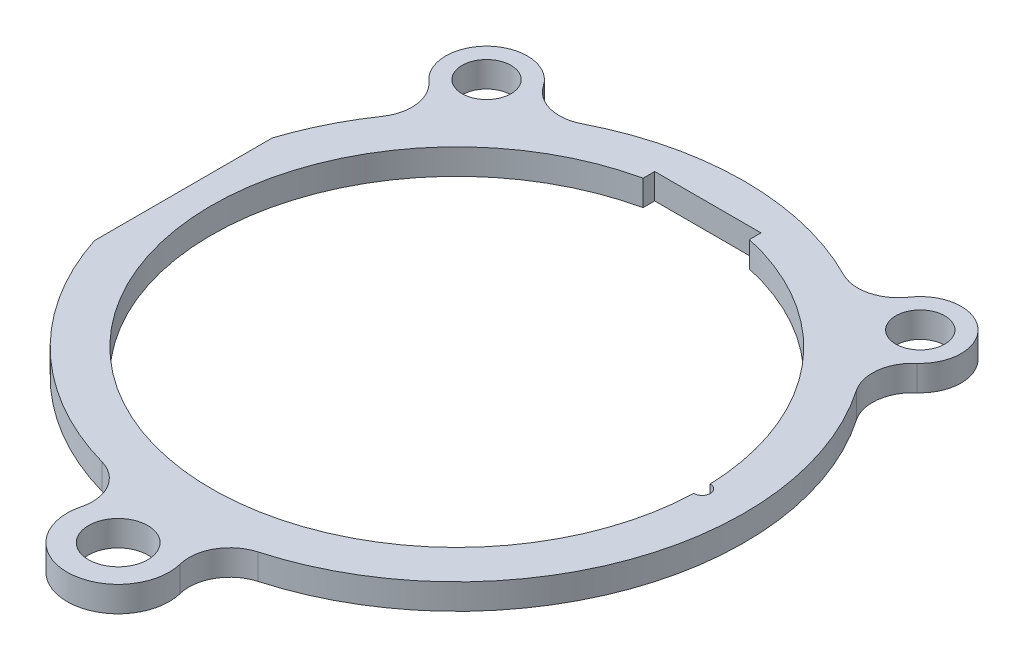
ISO-10303-21;
HEADER;
FILE_DESCRIPTION(('STEP AP214'),'2;1');
FILE_NAME('part.step','',(''),(''),'','','');
FILE_SCHEMA(('AUTOMOTIVE_DESIGN { 1 0 10303 214 1 1 1 1 }'));
ENDSEC;
DATA;
#1=APPLICATION_CONTEXT('core data for automotive mechanical design processes');
#2=APPLICATION_PROTOCOL_DEFINITION('international standard','automotive_design',2000,#1);
#3=PRODUCT_CONTEXT('',#1,'mechanical');
#4=PRODUCT('Part','Part','',(#3));
#5=PRODUCT_RELATED_PRODUCT_CATEGORY('part','',(#4));
#6=PRODUCT_DEFINITION_FORMATION('','',#4);
#7=PRODUCT_DEFINITION_CONTEXT('part definition',#1,'design');
#8=PRODUCT_DEFINITION('design','',#6,#7);
#9=PRODUCT_DEFINITION_SHAPE('','',#8);
#10=(LENGTH_UNIT() NAMED_UNIT(*) SI_UNIT(.MILLI.,.METRE.));
#11=(NAMED_UNIT(*) PLANE_ANGLE_UNIT() SI_UNIT($,.RADIAN.));
#12=(NAMED_UNIT(*) SI_UNIT($,.STERADIAN.) SOLID_ANGLE_UNIT());
#13=UNCERTAINTY_MEASURE_WITH_UNIT(LENGTH_MEASURE(1.E-05),#10,'distance_accuracy_value','');
#14=(GEOMETRIC_REPRESENTATION_CONTEXT(3) GLOBAL_UNCERTAINTY_ASSIGNED_CONTEXT((#13)) GLOBAL_UNIT_ASSIGNED_CONTEXT((#10,
#11,#12)) REPRESENTATION_CONTEXT('',''));
#15=CARTESIAN_POINT('',(0.,0.,0.));
#16=DIRECTION('',(0.,0.,1.));
#17=DIRECTION('',(1.,0.,0.));
#18=AXIS2_PLACEMENT_3D('',#15,#16,#17);
#19=CARTESIAN_POINT('',(0.,-0.79375,0.));
#20=DIRECTION('',(0.,1.,0.));
#21=DIRECTION('',(0.,0.,1.));
#22=AXIS2_PLACEMENT_3D('',#19,#20,#21);
#23=CYLINDRICAL_SURFACE('',#22,17.8599650524873);
#24=CARTESIAN_POINT('',(0.,-0.79375,0.));
#25=DIRECTION('',(0.,1.,0.));
#26=DIRECTION('',(0.,0.,1.));
#27=AXIS2_PLACEMENT_3D('',#24,#25,#26);
#28=CIRCLE('',#27,17.8599650524873);
#29=CARTESIAN_POINT('',(-16.9840587441892,-0.79375,5.5245));
#30=VERTEX_POINT('',#29);
#31=CARTESIAN_POINT('',(-4.85058295667171,-0.79375,17.1886647723584));
#32=VERTEX_POINT('',#31);
#33=EDGE_CURVE('E280',#30,#32,#28,.T.);
#34=ORIENTED_EDGE('',*,*,#33,.T.);
#35=DIRECTION('',(0.,1.,0.));
#36=VECTOR('',#35,1.);
#37=CARTESIAN_POINT('',(-4.85058295667171,-0.79375,17.1886647723584));
#38=LINE('',#37,#36);
#39=CARTESIAN_POINT('',(-4.85058295667171,0.79375,17.1886647723584));
#40=VERTEX_POINT('',#39);
#41=EDGE_CURVE('E218',#32,#40,#38,.T.);
#42=ORIENTED_EDGE('',*,*,#41,.T.);
#43=CARTESIAN_POINT('',(0.,0.79375,0.));
#44=DIRECTION('',(0.,1.,0.));
#45=DIRECTION('',(0.,0.,1.));
#46=AXIS2_PLACEMENT_3D('',#43,#44,#45);
#47=CIRCLE('',#46,17.8599650524873);
#48=CARTESIAN_POINT('',(-16.9840587441892,0.79375,5.5245));
#49=VERTEX_POINT('',#48);
#50=EDGE_CURVE('E273',#49,#40,#47,.T.);
#51=ORIENTED_EDGE('',*,*,#50,.F.);
#52=DIRECTION('',(0.,1.,0.));
#53=VECTOR('',#52,1.);
#54=CARTESIAN_POINT('',(-16.9840587441892,-0.79375,5.5245));
#55=LINE('',#54,#53);
#56=EDGE_CURVE('E304',#30,#49,#55,.T.);
#57=ORIENTED_EDGE('',*,*,#56,.F.);
#58=EDGE_LOOP('',(#34,#42,#51,#57));
#59=FACE_BOUND('',#58,.T.);
#60=ADVANCED_FACE('F37',(#59),#23,.T.);
#61=CARTESIAN_POINT('',(0.,-0.79375,0.));
#62=DIRECTION('',(0.,1.,0.));
#63=DIRECTION('',(0.,0.,1.));
#64=AXIS2_PLACEMENT_3D('',#61,#62,#63);
#65=CYLINDRICAL_SURFACE('',#64,17.8599650524873);
#66=DIRECTION('',(0.,1.,0.));
#67=VECTOR('',#66,1.);
#68=CARTESIAN_POINT('',(4.85058295667171,-0.79375,17.1886647723584));
#69=LINE('',#68,#67);
#70=CARTESIAN_POINT('',(4.85058295667171,-0.79375,17.1886647723584));
#71=VERTEX_POINT('',#70);
#72=CARTESIAN_POINT('',(4.85058295667171,0.79375,17.1886647723584));
#73=VERTEX_POINT('',#72);
#74=EDGE_CURVE('E197',#71,#73,#69,.T.);
#75=ORIENTED_EDGE('',*,*,#74,.F.);
#76=CARTESIAN_POINT('',(0.,-0.79375,0.));
#77=DIRECTION('',(0.,1.,0.));
#78=DIRECTION('',(0.,0.,1.));
#79=AXIS2_PLACEMENT_3D('',#76,#77,#78);
#80=CIRCLE('',#79,17.8599650524873);
#81=CARTESIAN_POINT('',(14.741706385558,-0.79375,-10.0826804232836));
#82=VERTEX_POINT('',#81);
#83=EDGE_CURVE('E184',#71,#82,#80,.T.);
#84=ORIENTED_EDGE('',*,*,#83,.T.);
#85=DIRECTION('',(0.,1.,0.));
#86=VECTOR('',#85,1.);
#87=CARTESIAN_POINT('',(14.741706385558,-0.79375,-10.0826804232836));
#88=LINE('',#87,#86);
#89=CARTESIAN_POINT('',(14.741706385558,0.79375,-10.0826804232836));
#90=VERTEX_POINT('',#89);
#91=EDGE_CURVE('E270',#82,#90,#88,.T.);
#92=ORIENTED_EDGE('',*,*,#91,.T.);
#93=CARTESIAN_POINT('',(0.,0.79375,0.));
#94=DIRECTION('',(0.,1.,0.));
#95=DIRECTION('',(0.,0.,1.));
#96=AXIS2_PLACEMENT_3D('',#93,#94,#95);
#97=CIRCLE('',#96,17.8599650524873);
#98=EDGE_CURVE('E284',#73,#90,#97,.T.);
#99=ORIENTED_EDGE('',*,*,#98,.F.);
#100=EDGE_LOOP('',(#75,#84,#92,#99));
#101=FACE_BOUND('',#100,.T.);
#102=ADVANCED_FACE('F380',(#101),#65,.T.);
#103=CARTESIAN_POINT('',(0.,0.79375,0.));
#104=DIRECTION('',(0.,1.,0.));
#105=DIRECTION('',(0.,0.,1.));
#106=AXIS2_PLACEMENT_3D('',#103,#104,#105);
#107=PLANE('',#106);
#108=CARTESIAN_POINT('',(5.54042085242001,0.79375,19.6331941089771));
#109=DIRECTION('',(0.,1.,0.));
#110=DIRECTION('',(0.,0.,1.));
#111=AXIS2_PLACEMENT_3D('',#108,#109,#110);
#112=CIRCLE('',#111,2.54);
#113=CARTESIAN_POINT('',(3.07801158467778,0.79375,20.2562034172039));
#114=VERTEX_POINT('',#113);
#115=EDGE_CURVE('E193',#73,#114,#112,.T.);
#116=ORIENTED_EDGE('',*,*,#115,.F.);
#117=ORIENTED_EDGE('',*,*,#98,.T.);
#118=CARTESIAN_POINT('',(16.8382353602383,0.79375,-11.5166142635726));
#119=DIRECTION('',(0.,1.,0.));
#120=DIRECTION('',(0.,0.,1.));
#121=AXIS2_PLACEMENT_3D('',#118,#119,#120);
#122=CIRCLE('',#121,2.54);
#123=CARTESIAN_POINT('',(15.1544210313661,0.79375,-13.41828965803));
#124=VERTEX_POINT('',#123);
#125=EDGE_CURVE('E242',#124,#90,#122,.T.);
#126=ORIENTED_EDGE('',*,*,#125,.F.);
#127=CARTESIAN_POINT('',(13.4706067024938,0.79375,-15.3199650524873));
#128=DIRECTION('',(0.,1.,0.));
#129=DIRECTION('',(0.,0.,1.));
#130=AXIS2_PLACEMENT_3D('',#127,#128,#129);
#131=CIRCLE('',#130,2.54);
#132=CARTESIAN_POINT('',(11.3691296286891,0.79375,-16.746637442447));
#133=VERTEX_POINT('',#132);
#134=EDGE_CURVE('E262',#124,#133,#131,.T.);
#135=ORIENTED_EDGE('',*,*,#134,.T.);
#136=CARTESIAN_POINT('',(9.26765255488442,0.79375,-18.1733098324067));
#137=DIRECTION('',(0.,1.,0.));
#138=DIRECTION('',(0.,0.,1.));
#139=AXIS2_PLACEMENT_3D('',#136,#137,#138);
#140=CIRCLE('',#139,2.54);
#141=CARTESIAN_POINT('',(8.11373697567434,0.79375,-15.9105507122049));
#142=VERTEX_POINT('',#141);
#143=EDGE_CURVE('E265',#142,#133,#140,.T.);
#144=ORIENTED_EDGE('',*,*,#143,.F.);
#145=CARTESIAN_POINT('',(0.,0.79375,0.));
#146=DIRECTION('',(0.,1.,0.));
#147=DIRECTION('',(0.,0.,1.));
#148=AXIS2_PLACEMENT_3D('',#145,#146,#147);
#149=CIRCLE('',#148,17.8599650524873);
#150=CARTESIAN_POINT('',(-8.11373697567434,0.79375,-15.9105507122049));
#151=VERTEX_POINT('',#150);
#152=EDGE_CURVE('E60',#142,#151,#149,.T.);
#153=ORIENTED_EDGE('',*,*,#152,.T.);
#154=CARTESIAN_POINT('',(-9.26765255488442,0.79375,-18.1733098324067));
#155=DIRECTION('',(0.,1.,0.));
#156=DIRECTION('',(0.,0.,1.));
#157=AXIS2_PLACEMENT_3D('',#154,#155,#156);
#158=CIRCLE('',#157,2.54);
#159=CARTESIAN_POINT('',(-11.3691296286891,0.79375,-16.746637442447));
#160=VERTEX_POINT('',#159);
#161=EDGE_CURVE('E217',#160,#151,#158,.T.);
#162=ORIENTED_EDGE('',*,*,#161,.F.);
#163=CARTESIAN_POINT('',(-13.4706067024938,0.79375,-15.3199650524873));
#164=DIRECTION('',(0.,1.,0.));
#165=DIRECTION('',(0.,0.,1.));
#166=AXIS2_PLACEMENT_3D('',#163,#164,#165);
#167=CIRCLE('',#166,2.54);
#168=CARTESIAN_POINT('',(-15.1544210313661,0.79375,-13.41828965803));
#169=VERTEX_POINT('',#168);
#170=EDGE_CURVE('E235',#160,#169,#167,.T.);
#171=ORIENTED_EDGE('',*,*,#170,.T.);
#172=CARTESIAN_POINT('',(-16.8382353602383,0.79375,-11.5166142635726));
#173=DIRECTION('',(0.,1.,0.));
#174=DIRECTION('',(0.,0.,1.));
#175=AXIS2_PLACEMENT_3D('',#172,#173,#174);
#176=CIRCLE('',#175,2.54);
#177=CARTESIAN_POINT('',(-14.741706385558,0.79375,-10.0826804232836));
#178=VERTEX_POINT('',#177);
#179=EDGE_CURVE('E52',#178,#169,#176,.T.);
#180=ORIENTED_EDGE('',*,*,#179,.F.);
#181=CARTESIAN_POINT('',(-16.9840587441892,0.79375,-5.5245));
#182=VERTEX_POINT('',#181);
#183=EDGE_CURVE('E292',#178,#182,#149,.T.);
#184=ORIENTED_EDGE('',*,*,#183,.T.);
#185=DIRECTION('',(0.,0.,-1.));
#186=VECTOR('',#185,1.);
#187=CARTESIAN_POINT('',(-16.9840587441892,0.79375,-5.5245));
#188=LINE('',#187,#186);
#189=EDGE_CURVE('E300',#49,#182,#188,.T.);
#190=ORIENTED_EDGE('',*,*,#189,.F.);
#191=ORIENTED_EDGE('',*,*,#50,.T.);
#192=CARTESIAN_POINT('',(-5.54042085242001,0.79375,19.6331941089771));
#193=DIRECTION('',(0.,1.,0.));
#194=DIRECTION('',(0.,0.,1.));
#195=AXIS2_PLACEMENT_3D('',#192,#193,#194);
#196=CIRCLE('',#195,2.54);
#197=CARTESIAN_POINT('',(-3.07801158467778,0.79375,20.2562034172039));
#198=VERTEX_POINT('',#197);
#199=EDGE_CURVE('E205',#198,#40,#196,.T.);
#200=ORIENTED_EDGE('',*,*,#199,.F.);
#201=CARTESIAN_POINT('',(0.,0.79375,21.0349650524873));
#202=DIRECTION('',(0.,1.,0.));
#203=DIRECTION('',(0.,0.,1.));
#204=AXIS2_PLACEMENT_3D('',#201,#202,#203);
#205=CIRCLE('',#204,3.175);
#206=EDGE_CURVE('E212',#198,#114,#205,.T.);
#207=ORIENTED_EDGE('',*,*,#206,.T.);
#208=EDGE_LOOP('',(#116,#117,#126,#135,#144,#153,#162,#171,#180,#184,#190,#191,#200,#207));
#209=FACE_BOUND('',#208,.T.);
#210=CARTESIAN_POINT('',(15.24,0.79375,0.));
#211=DIRECTION('',(0.,1.,0.));
#212=DIRECTION('',(0.,0.,1.));
#213=AXIS2_PLACEMENT_3D('',#210,#211,#212);
#214=CIRCLE('',#213,0.508000000000006);
#215=CARTESIAN_POINT('',(15.2315333333333,0.79375,0.507929439544078));
#216=VERTEX_POINT('',#215);
#217=CARTESIAN_POINT('',(15.2315333333333,0.79375,-0.507929439544078));
#218=VERTEX_POINT('',#217);
#219=EDGE_CURVE('E289',#216,#218,#214,.T.);
#220=ORIENTED_EDGE('',*,*,#219,.F.);
#221=CARTESIAN_POINT('',(0.,0.79375,0.));
#222=DIRECTION('',(0.,1.,0.));
#223=DIRECTION('',(0.,0.,1.));
#224=AXIS2_PLACEMENT_3D('',#221,#222,#223);
#225=CIRCLE('',#224,15.24);
#226=CARTESIAN_POINT('',(-3.302,0.79375,-14.8779835999372));
#227=VERTEX_POINT('',#226);
#228=EDGE_CURVE('E313',#227,#216,#225,.T.);
#229=ORIENTED_EDGE('',*,*,#228,.F.);
#230=DIRECTION('',(0.,0.,1.));
#231=VECTOR('',#230,1.);
#232=CARTESIAN_POINT('',(-3.30199999999999,0.79375,0.));
#233=LINE('',#232,#231);
#234=CARTESIAN_POINT('',(-3.302,0.79375,-15.5956));
#235=VERTEX_POINT('',#234);
#236=EDGE_CURVE('E316',#235,#227,#233,.T.);
#237=ORIENTED_EDGE('',*,*,#236,.F.);
#238=DIRECTION('',(1.,0.,0.));
#239=VECTOR('',#238,1.);
#240=CARTESIAN_POINT('',(0.,0.79375,-15.5956));
#241=LINE('',#240,#239);
#242=CARTESIAN_POINT('',(3.302,0.79375,-15.5956));
#243=VERTEX_POINT('',#242);
#244=EDGE_CURVE('E320',#235,#243,#241,.T.);
#245=ORIENTED_EDGE('',*,*,#244,.T.);
#246=DIRECTION('',(0.,0.,1.));
#247=VECTOR('',#246,1.);
#248=CARTESIAN_POINT('',(3.302,0.79375,0.));
#249=LINE('',#248,#247);
#250=CARTESIAN_POINT('',(3.302,0.79375,-14.8779835999372));
#251=VERTEX_POINT('',#250);
#252=EDGE_CURVE('E322',#243,#251,#249,.T.);
#253=ORIENTED_EDGE('',*,*,#252,.T.);
#254=EDGE_CURVE('E317',#218,#251,#225,.T.);
#255=ORIENTED_EDGE('',*,*,#254,.F.);
#256=EDGE_LOOP('',(#220,#229,#237,#245,#253,#255));
#257=FACE_BOUND('',#256,.T.);
#258=CARTESIAN_POINT('',(13.4706067024938,0.79375,-15.3199650524873));
#259=DIRECTION('',(0.,1.,0.));
#260=DIRECTION('',(0.,0.,1.));
#261=AXIS2_PLACEMENT_3D('',#258,#259,#260);
#262=CIRCLE('',#261,1.524);
#263=CARTESIAN_POINT('',(13.4706067024938,0.79375,-13.7959650524873));
#264=VERTEX_POINT('',#263);
#265=EDGE_CURVE('E251',#264,#264,#262,.T.);
#266=ORIENTED_EDGE('',*,*,#265,.F.);
#267=EDGE_LOOP('',(#266));
#268=FACE_BOUND('',#267,.T.);
#269=CARTESIAN_POINT('',(-13.4706067024938,0.79375,-15.3199650524873));
#270=DIRECTION('',(0.,1.,0.));
#271=DIRECTION('',(0.,0.,1.));
#272=AXIS2_PLACEMENT_3D('',#269,#270,#271);
#273=CIRCLE('',#272,1.524);
#274=CARTESIAN_POINT('',(-13.4706067024938,0.79375,-13.7959650524873));
#275=VERTEX_POINT('',#274);
#276=EDGE_CURVE('E225',#275,#275,#273,.T.);
#277=ORIENTED_EDGE('',*,*,#276,.F.);
#278=EDGE_LOOP('',(#277));
#279=FACE_BOUND('',#278,.T.);
#280=CARTESIAN_POINT('',(0.,0.79375,21.0349650524873));
#281=DIRECTION('',(0.,1.,0.));
#282=DIRECTION('',(0.,0.,1.));
#283=AXIS2_PLACEMENT_3D('',#280,#281,#282);
#284=CIRCLE('',#283,1.8415);
#285=CARTESIAN_POINT('',(0.,0.79375,22.8764650524873));
#286=VERTEX_POINT('',#285);
#287=EDGE_CURVE('E209',#286,#286,#284,.T.);
#288=ORIENTED_EDGE('',*,*,#287,.F.);
#289=EDGE_LOOP('',(#288));
#290=FACE_BOUND('',#289,.T.);
#291=ADVANCED_FACE('F366',(#209,#257,#268,#279,#290),#107,.T.);
#292=CARTESIAN_POINT('',(0.,-0.79375,0.));
#293=DIRECTION('',(0.,1.,0.));
#294=DIRECTION('',(0.,0.,1.));
#295=AXIS2_PLACEMENT_3D('',#292,#293,#294);
#296=PLANE('',#295);
#297=ORIENTED_EDGE('',*,*,#83,.F.);
#298=CARTESIAN_POINT('',(5.54042085242001,-0.79375,19.6331941089771));
#299=DIRECTION('',(0.,1.,0.));
#300=DIRECTION('',(0.,0.,1.));
#301=AXIS2_PLACEMENT_3D('',#298,#299,#300);
#302=CIRCLE('',#301,2.54);
#303=CARTESIAN_POINT('',(3.07801158467778,-0.79375,20.2562034172039));
#304=VERTEX_POINT('',#303);
#305=EDGE_CURVE('E177',#71,#304,#302,.T.);
#306=ORIENTED_EDGE('',*,*,#305,.T.);
#307=CARTESIAN_POINT('',(0.,-0.79375,21.0349650524873));
#308=DIRECTION('',(0.,1.,0.));
#309=DIRECTION('',(0.,0.,1.));
#310=AXIS2_PLACEMENT_3D('',#307,#308,#309);
#311=CIRCLE('',#310,3.175);
#312=CARTESIAN_POINT('',(-3.07801158467778,-0.79375,20.2562034172039));
#313=VERTEX_POINT('',#312);
#314=EDGE_CURVE('E182',#313,#304,#311,.T.);
#315=ORIENTED_EDGE('',*,*,#314,.F.);
#316=CARTESIAN_POINT('',(-5.54042085242001,-0.79375,19.6331941089771));
#317=DIRECTION('',(0.,1.,0.));
#318=DIRECTION('',(0.,0.,1.));
#319=AXIS2_PLACEMENT_3D('',#316,#317,#318);
#320=CIRCLE('',#319,2.54);
#321=EDGE_CURVE('E188',#313,#32,#320,.T.);
#322=ORIENTED_EDGE('',*,*,#321,.T.);
#323=ORIENTED_EDGE('',*,*,#33,.F.);
#324=DIRECTION('',(0.,0.,-1.));
#325=VECTOR('',#324,1.);
#326=CARTESIAN_POINT('',(-16.9840587441892,-0.79375,-5.5245));
#327=LINE('',#326,#325);
#328=CARTESIAN_POINT('',(-16.9840587441892,-0.79375,-5.5245));
#329=VERTEX_POINT('',#328);
#330=EDGE_CURVE('E301',#30,#329,#327,.T.);
#331=ORIENTED_EDGE('',*,*,#330,.T.);
#332=CARTESIAN_POINT('',(0.,-0.79375,0.));
#333=DIRECTION('',(0.,1.,0.));
#334=DIRECTION('',(0.,0.,1.));
#335=AXIS2_PLACEMENT_3D('',#332,#333,#334);
#336=CIRCLE('',#335,17.8599650524873);
#337=CARTESIAN_POINT('',(-14.741706385558,-0.79375,-10.0826804232836));
#338=VERTEX_POINT('',#337);
#339=EDGE_CURVE('E283',#338,#329,#336,.T.);
#340=ORIENTED_EDGE('',*,*,#339,.F.);
#341=CARTESIAN_POINT('',(-16.8382353602383,-0.79375,-11.5166142635726));
#342=DIRECTION('',(0.,1.,0.));
#343=DIRECTION('',(0.,0.,1.));
#344=AXIS2_PLACEMENT_3D('',#341,#342,#343);
#345=CIRCLE('',#344,2.54);
#346=CARTESIAN_POINT('',(-15.1544210313661,-0.79375,-13.41828965803));
#347=VERTEX_POINT('',#346);
#348=EDGE_CURVE('E228',#338,#347,#345,.T.);
#349=ORIENTED_EDGE('',*,*,#348,.T.);
#350=CARTESIAN_POINT('',(-13.4706067024938,-0.79375,-15.3199650524873));
#351=DIRECTION('',(0.,1.,0.));
#352=DIRECTION('',(0.,0.,1.));
#353=AXIS2_PLACEMENT_3D('',#350,#351,#352);
#354=CIRCLE('',#353,2.54);
#355=CARTESIAN_POINT('',(-11.3691296286891,-0.79375,-16.746637442447));
#356=VERTEX_POINT('',#355);
#357=EDGE_CURVE('E224',#356,#347,#354,.T.);
#358=ORIENTED_EDGE('',*,*,#357,.F.);
#359=CARTESIAN_POINT('',(-9.26765255488442,-0.79375,-18.1733098324067));
#360=DIRECTION('',(0.,1.,0.));
#361=DIRECTION('',(0.,0.,1.));
#362=AXIS2_PLACEMENT_3D('',#359,#360,#361);
#363=CIRCLE('',#362,2.54);
#364=CARTESIAN_POINT('',(-8.11373697567434,-0.79375,-15.9105507122049));
#365=VERTEX_POINT('',#364);
#366=EDGE_CURVE('E222',#356,#365,#363,.T.);
#367=ORIENTED_EDGE('',*,*,#366,.T.);
#368=CARTESIAN_POINT('',(8.11373697567434,-0.79375,-15.9105507122049));
#369=VERTEX_POINT('',#368);
#370=EDGE_CURVE('E285',#369,#365,#336,.T.);
#371=ORIENTED_EDGE('',*,*,#370,.F.);
#372=CARTESIAN_POINT('',(9.26765255488442,-0.79375,-18.1733098324067));
#373=DIRECTION('',(0.,1.,0.));
#374=DIRECTION('',(0.,0.,1.));
#375=AXIS2_PLACEMENT_3D('',#372,#373,#374);
#376=CIRCLE('',#375,2.54);
#377=CARTESIAN_POINT('',(11.3691296286891,-0.79375,-16.746637442447));
#378=VERTEX_POINT('',#377);
#379=EDGE_CURVE('E254',#369,#378,#376,.T.);
#380=ORIENTED_EDGE('',*,*,#379,.T.);
#381=CARTESIAN_POINT('',(13.4706067024938,-0.79375,-15.3199650524873));
#382=DIRECTION('',(0.,1.,0.));
#383=DIRECTION('',(0.,0.,1.));
#384=AXIS2_PLACEMENT_3D('',#381,#382,#383);
#385=CIRCLE('',#384,2.54);
#386=CARTESIAN_POINT('',(15.1544210313661,-0.79375,-13.41828965803));
#387=VERTEX_POINT('',#386);
#388=EDGE_CURVE('E250',#387,#378,#385,.T.);
#389=ORIENTED_EDGE('',*,*,#388,.F.);
#390=CARTESIAN_POINT('',(16.8382353602383,-0.79375,-11.5166142635726));
#391=DIRECTION('',(0.,1.,0.));
#392=DIRECTION('',(0.,0.,1.));
#393=AXIS2_PLACEMENT_3D('',#390,#391,#392);
#394=CIRCLE('',#393,2.54);
#395=EDGE_CURVE('E248',#387,#82,#394,.T.);
#396=ORIENTED_EDGE('',*,*,#395,.T.);
#397=EDGE_LOOP('',(#297,#306,#315,#322,#323,#331,#340,#349,#358,#367,#371,#380,#389,#396));
#398=FACE_BOUND('',#397,.T.);
#399=CARTESIAN_POINT('',(0.,-0.79375,0.));
#400=DIRECTION('',(0.,1.,0.));
#401=DIRECTION('',(0.,0.,1.));
#402=AXIS2_PLACEMENT_3D('',#399,#400,#401);
#403=CIRCLE('',#402,15.24);
#404=CARTESIAN_POINT('',(-3.302,-0.79375,-14.8779835999372));
#405=VERTEX_POINT('',#404);
#406=CARTESIAN_POINT('',(15.2315333333333,-0.79375,0.507929439544078));
#407=VERTEX_POINT('',#406);
#408=EDGE_CURVE('E326',#405,#407,#403,.T.);
#409=ORIENTED_EDGE('',*,*,#408,.T.);
#410=CARTESIAN_POINT('',(15.24,-0.79375,0.));
#411=DIRECTION('',(0.,1.,0.));
#412=DIRECTION('',(0.,0.,1.));
#413=AXIS2_PLACEMENT_3D('',#410,#411,#412);
#414=CIRCLE('',#413,0.508000000000006);
#415=CARTESIAN_POINT('',(15.2315333333333,-0.79375,-0.50792943954407));
#416=VERTEX_POINT('',#415);
#417=EDGE_CURVE('E11',#407,#416,#414,.T.);
#418=ORIENTED_EDGE('',*,*,#417,.T.);
#419=CARTESIAN_POINT('',(3.302,-0.79375,-14.8779835999372));
#420=VERTEX_POINT('',#419);
#421=EDGE_CURVE('E310',#416,#420,#403,.T.);
#422=ORIENTED_EDGE('',*,*,#421,.T.);
#423=DIRECTION('',(0.,0.,1.));
#424=VECTOR('',#423,1.);
#425=CARTESIAN_POINT('',(3.302,-0.79375,0.));
#426=LINE('',#425,#424);
#427=CARTESIAN_POINT('',(3.302,-0.79375,-15.5956));
#428=VERTEX_POINT('',#427);
#429=EDGE_CURVE('E334',#428,#420,#426,.T.);
#430=ORIENTED_EDGE('',*,*,#429,.F.);
#431=DIRECTION('',(1.,0.,0.));
#432=VECTOR('',#431,1.);
#433=CARTESIAN_POINT('',(0.,-0.79375,-15.5956));
#434=LINE('',#433,#432);
#435=CARTESIAN_POINT('',(-3.302,-0.79375,-15.5956));
#436=VERTEX_POINT('',#435);
#437=EDGE_CURVE('E332',#436,#428,#434,.T.);
#438=ORIENTED_EDGE('',*,*,#437,.F.);
#439=DIRECTION('',(0.,0.,1.));
#440=VECTOR('',#439,1.);
#441=CARTESIAN_POINT('',(-3.30199999999999,-0.79375,0.));
#442=LINE('',#441,#440);
#443=EDGE_CURVE('E329',#436,#405,#442,.T.);
#444=ORIENTED_EDGE('',*,*,#443,.T.);
#445=EDGE_LOOP('',(#409,#418,#422,#430,#438,#444));
#446=FACE_BOUND('',#445,.T.);
#447=CARTESIAN_POINT('',(13.4706067024938,-0.79375,-15.3199650524873));
#448=DIRECTION('',(0.,1.,0.));
#449=DIRECTION('',(0.,0.,1.));
#450=AXIS2_PLACEMENT_3D('',#447,#448,#449);
#451=CIRCLE('',#450,1.524);
#452=CARTESIAN_POINT('',(13.4706067024938,-0.79375,-13.7959650524873));
#453=VERTEX_POINT('',#452);
#454=EDGE_CURVE('E256',#453,#453,#451,.T.);
#455=ORIENTED_EDGE('',*,*,#454,.T.);
#456=EDGE_LOOP('',(#455));
#457=FACE_BOUND('',#456,.T.);
#458=CARTESIAN_POINT('',(-13.4706067024938,-0.79375,-15.3199650524873));
#459=DIRECTION('',(0.,1.,0.));
#460=DIRECTION('',(0.,0.,1.));
#461=AXIS2_PLACEMENT_3D('',#458,#459,#460);
#462=CIRCLE('',#461,1.524);
#463=CARTESIAN_POINT('',(-13.4706067024938,-0.79375,-13.7959650524873));
#464=VERTEX_POINT('',#463);
#465=EDGE_CURVE('E230',#464,#464,#462,.T.);
#466=ORIENTED_EDGE('',*,*,#465,.T.);
#467=EDGE_LOOP('',(#466));
#468=FACE_BOUND('',#467,.T.);
#469=CARTESIAN_POINT('',(0.,-0.79375,21.0349650524873));
#470=DIRECTION('',(0.,1.,0.));
#471=DIRECTION('',(0.,0.,1.));
#472=AXIS2_PLACEMENT_3D('',#469,#470,#471);
#473=CIRCLE('',#472,1.8415);
#474=CARTESIAN_POINT('',(0.,-0.79375,22.8764650524873));
#475=VERTEX_POINT('',#474);
#476=EDGE_CURVE('E202',#475,#475,#473,.T.);
#477=ORIENTED_EDGE('',*,*,#476,.T.);
#478=EDGE_LOOP('',(#477));
#479=FACE_BOUND('',#478,.T.);
#480=ADVANCED_FACE('F179',(#398,#446,#457,#468,#479),#296,.F.);
#481=CARTESIAN_POINT('',(0.,0.79375,0.));
#482=DIRECTION('',(0.,-1.,0.));
#483=DIRECTION('',(0.,0.,-1.));
#484=AXIS2_PLACEMENT_3D('',#481,#482,#483);
#485=CYLINDRICAL_SURFACE('',#484,15.24);
#486=DIRECTION('',(0.,1.,0.));
#487=VECTOR('',#486,1.);
#488=CARTESIAN_POINT('',(15.2315333333333,0.,0.507929439544078));
#489=LINE('',#488,#487);
#490=EDGE_CURVE('E298',#407,#216,#489,.T.);
#491=ORIENTED_EDGE('',*,*,#490,.F.);
#492=ORIENTED_EDGE('',*,*,#408,.F.);
#493=DIRECTION('',(0.,-1.,0.));
#494=VECTOR('',#493,1.);
#495=CARTESIAN_POINT('',(-3.302,0.79375,-14.8779835999372));
#496=LINE('',#495,#494);
#497=EDGE_CURVE('E45',#227,#405,#496,.T.);
#498=ORIENTED_EDGE('',*,*,#497,.F.);
#499=ORIENTED_EDGE('',*,*,#228,.T.);
#500=EDGE_LOOP('',(#491,#492,#498,#499));
#501=FACE_BOUND('',#500,.T.);
#502=ADVANCED_FACE('F351',(#501),#485,.F.);
#503=DIRECTION('',(0.,1.,0.));
#504=VECTOR('',#503,1.);
#505=CARTESIAN_POINT('',(15.2315333333333,0.,-0.507929439544078));
#506=LINE('',#505,#504);
#507=EDGE_CURVE('E296',#218,#416,#506,.F.);
#508=ORIENTED_EDGE('',*,*,#507,.F.);
#509=ORIENTED_EDGE('',*,*,#254,.T.);
#510=DIRECTION('',(0.,-1.,0.));
#511=VECTOR('',#510,1.);
#512=CARTESIAN_POINT('',(3.302,0.79375,-14.8779835999372));
#513=LINE('',#512,#511);
#514=EDGE_CURVE('E325',#251,#420,#513,.T.);
#515=ORIENTED_EDGE('',*,*,#514,.T.);
#516=ORIENTED_EDGE('',*,*,#421,.F.);
#517=EDGE_LOOP('',(#508,#509,#515,#516));
#518=FACE_BOUND('',#517,.T.);
#519=ADVANCED_FACE('F39',(#518),#485,.F.);
#520=CARTESIAN_POINT('',(-3.30199999999999,0.79375,0.));
#521=DIRECTION('',(1.,0.,0.));
#522=DIRECTION('',(0.,0.,-1.));
#523=AXIS2_PLACEMENT_3D('',#520,#521,#522);
#524=PLANE('',#523);
#525=ORIENTED_EDGE('',*,*,#443,.F.);
#526=DIRECTION('',(0.,-1.,0.));
#527=VECTOR('',#526,1.);
#528=CARTESIAN_POINT('',(-3.302,0.79375,-15.5956));
#529=LINE('',#528,#527);
#530=EDGE_CURVE('E342',#235,#436,#529,.T.);
#531=ORIENTED_EDGE('',*,*,#530,.F.);
#532=ORIENTED_EDGE('',*,*,#236,.T.);
#533=ORIENTED_EDGE('',*,*,#497,.T.);
#534=EDGE_LOOP('',(#525,#531,#532,#533));
#535=FACE_BOUND('',#534,.T.);
#536=ADVANCED_FACE('F346',(#535),#524,.T.);
#537=CARTESIAN_POINT('',(0.,0.79375,-15.5956));
#538=DIRECTION('',(0.,0.,-1.));
#539=DIRECTION('',(-1.,0.,0.));
#540=AXIS2_PLACEMENT_3D('',#537,#538,#539);
#541=PLANE('',#540);
#542=ORIENTED_EDGE('',*,*,#437,.T.);
#543=DIRECTION('',(0.,-1.,0.));
#544=VECTOR('',#543,1.);
#545=CARTESIAN_POINT('',(3.302,0.79375,-15.5956));
#546=LINE('',#545,#544);
#547=EDGE_CURVE('E339',#243,#428,#546,.T.);
#548=ORIENTED_EDGE('',*,*,#547,.F.);
#549=ORIENTED_EDGE('',*,*,#244,.F.);
#550=ORIENTED_EDGE('',*,*,#530,.T.);
#551=EDGE_LOOP('',(#542,#548,#549,#550));
#552=FACE_BOUND('',#551,.T.);
#553=ADVANCED_FACE('F357',(#552),#541,.F.);
#554=CARTESIAN_POINT('',(3.302,0.79375,0.));
#555=DIRECTION('',(1.,0.,0.));
#556=DIRECTION('',(0.,0.,-1.));
#557=AXIS2_PLACEMENT_3D('',#554,#555,#556);
#558=PLANE('',#557);
#559=ORIENTED_EDGE('',*,*,#429,.T.);
#560=ORIENTED_EDGE('',*,*,#514,.F.);
#561=ORIENTED_EDGE('',*,*,#252,.F.);
#562=ORIENTED_EDGE('',*,*,#547,.T.);
#563=EDGE_LOOP('',(#559,#560,#561,#562));
#564=FACE_BOUND('',#563,.T.);
#565=ADVANCED_FACE('F361',(#564),#558,.F.);
#566=CARTESIAN_POINT('',(-16.9840587441892,-0.79375,-5.5245));
#567=DIRECTION('',(1.,0.,0.));
#568=DIRECTION('',(0.,0.,-1.));
#569=AXIS2_PLACEMENT_3D('',#566,#567,#568);
#570=PLANE('',#569);
#571=ORIENTED_EDGE('',*,*,#189,.T.);
#572=DIRECTION('',(0.,1.,0.));
#573=VECTOR('',#572,1.);
#574=CARTESIAN_POINT('',(-16.9840587441892,-0.79375,-5.5245));
#575=LINE('',#574,#573);
#576=EDGE_CURVE('E307',#329,#182,#575,.T.);
#577=ORIENTED_EDGE('',*,*,#576,.F.);
#578=ORIENTED_EDGE('',*,*,#330,.F.);
#579=ORIENTED_EDGE('',*,*,#56,.T.);
#580=EDGE_LOOP('',(#571,#577,#578,#579));
#581=FACE_BOUND('',#580,.T.);
#582=ADVANCED_FACE('F395',(#581),#570,.F.);
#583=CARTESIAN_POINT('',(15.24,-0.79375,0.));
#584=DIRECTION('',(0.,1.,0.));
#585=DIRECTION('',(0.,0.,1.));
#586=AXIS2_PLACEMENT_3D('',#583,#584,#585);
#587=CYLINDRICAL_SURFACE('',#586,0.508000000000006);
#588=ORIENTED_EDGE('',*,*,#490,.T.);
#589=ORIENTED_EDGE('',*,*,#219,.T.);
#590=ORIENTED_EDGE('',*,*,#507,.T.);
#591=ORIENTED_EDGE('',*,*,#417,.F.);
#592=EDGE_LOOP('',(#588,#589,#590,#591));
#593=FACE_BOUND('',#592,.T.);
#594=ADVANCED_FACE('F370',(#593),#587,.F.);
#595=DIRECTION('',(0.,1.,0.));
#596=VECTOR('',#595,1.);
#597=CARTESIAN_POINT('',(-14.741706385558,-0.79375,-10.0826804232836));
#598=LINE('',#597,#596);
#599=EDGE_CURVE('E243',#338,#178,#598,.T.);
#600=ORIENTED_EDGE('',*,*,#599,.F.);
#601=ORIENTED_EDGE('',*,*,#339,.T.);
#602=ORIENTED_EDGE('',*,*,#576,.T.);
#603=ORIENTED_EDGE('',*,*,#183,.F.);
#604=EDGE_LOOP('',(#600,#601,#602,#603));
#605=FACE_BOUND('',#604,.T.);
#606=ADVANCED_FACE('F389',(#605),#65,.T.);
#607=DIRECTION('',(0.,1.,0.));
#608=VECTOR('',#607,1.);
#609=CARTESIAN_POINT('',(8.11373697567434,-0.79375,-15.9105507122049));
#610=LINE('',#609,#608);
#611=EDGE_CURVE('E274',#369,#142,#610,.T.);
#612=ORIENTED_EDGE('',*,*,#611,.F.);
#613=ORIENTED_EDGE('',*,*,#370,.T.);
#614=DIRECTION('',(0.,1.,0.));
#615=VECTOR('',#614,1.);
#616=CARTESIAN_POINT('',(-8.11373697567434,-0.79375,-15.9105507122049));
#617=LINE('',#616,#615);
#618=EDGE_CURVE('E240',#365,#151,#617,.T.);
#619=ORIENTED_EDGE('',*,*,#618,.T.);
#620=ORIENTED_EDGE('',*,*,#152,.F.);
#621=EDGE_LOOP('',(#612,#613,#619,#620));
#622=FACE_BOUND('',#621,.T.);
#623=ADVANCED_FACE('F390',(#622),#65,.T.);
#624=CARTESIAN_POINT('',(16.8382353602383,-0.79375,-11.5166142635726));
#625=DIRECTION('',(0.,1.,0.));
#626=DIRECTION('',(0.,0.,1.));
#627=AXIS2_PLACEMENT_3D('',#624,#625,#626);
#628=CYLINDRICAL_SURFACE('',#627,2.54);
#629=ORIENTED_EDGE('',*,*,#125,.T.);
#630=ORIENTED_EDGE('',*,*,#91,.F.);
#631=ORIENTED_EDGE('',*,*,#395,.F.);
#632=DIRECTION('',(0.,1.,0.));
#633=VECTOR('',#632,1.);
#634=CARTESIAN_POINT('',(15.1544210313661,-0.79375,-13.41828965803));
#635=LINE('',#634,#633);
#636=EDGE_CURVE('E259',#387,#124,#635,.T.);
#637=ORIENTED_EDGE('',*,*,#636,.T.);
#638=EDGE_LOOP('',(#629,#630,#631,#637));
#639=FACE_BOUND('',#638,.T.);
#640=ADVANCED_FACE('F460',(#639),#628,.F.);
#641=CARTESIAN_POINT('',(9.26765255488442,-0.79375,-18.1733098324067));
#642=DIRECTION('',(0.,1.,0.));
#643=DIRECTION('',(0.,0.,1.));
#644=AXIS2_PLACEMENT_3D('',#641,#642,#643);
#645=CYLINDRICAL_SURFACE('',#644,2.54);
#646=ORIENTED_EDGE('',*,*,#143,.T.);
#647=DIRECTION('',(0.,1.,0.));
#648=VECTOR('',#647,1.);
#649=CARTESIAN_POINT('',(11.3691296286891,-0.79375,-16.746637442447));
#650=LINE('',#649,#648);
#651=EDGE_CURVE('E277',#378,#133,#650,.T.);
#652=ORIENTED_EDGE('',*,*,#651,.F.);
#653=ORIENTED_EDGE('',*,*,#379,.F.);
#654=ORIENTED_EDGE('',*,*,#611,.T.);
#655=EDGE_LOOP('',(#646,#652,#653,#654));
#656=FACE_BOUND('',#655,.T.);
#657=ADVANCED_FACE('F466',(#656),#645,.F.);
#658=CARTESIAN_POINT('',(13.4706067024938,-0.79375,-15.3199650524873));
#659=DIRECTION('',(0.,1.,0.));
#660=DIRECTION('',(0.,0.,1.));
#661=AXIS2_PLACEMENT_3D('',#658,#659,#660);
#662=CYLINDRICAL_SURFACE('',#661,2.54);
#663=ORIENTED_EDGE('',*,*,#134,.F.);
#664=ORIENTED_EDGE('',*,*,#636,.F.);
#665=ORIENTED_EDGE('',*,*,#388,.T.);
#666=ORIENTED_EDGE('',*,*,#651,.T.);
#667=EDGE_LOOP('',(#663,#664,#665,#666));
#668=FACE_BOUND('',#667,.T.);
#669=ADVANCED_FACE('F473',(#668),#662,.T.);
#670=CARTESIAN_POINT('',(13.4706067024938,-0.79375,-15.3199650524873));
#671=DIRECTION('',(0.,1.,0.));
#672=DIRECTION('',(0.,0.,1.));
#673=AXIS2_PLACEMENT_3D('',#670,#671,#672);
#674=CYLINDRICAL_SURFACE('',#673,1.524);
#675=ORIENTED_EDGE('',*,*,#454,.F.);
#676=EDGE_LOOP('',(#675));
#677=FACE_BOUND('',#676,.T.);
#678=ORIENTED_EDGE('',*,*,#265,.T.);
#679=EDGE_LOOP('',(#678));
#680=FACE_BOUND('',#679,.T.);
#681=ADVANCED_FACE('F481',(#677,#680),#674,.F.);
#682=CARTESIAN_POINT('',(-9.26765255488442,-0.79375,-18.1733098324067));
#683=DIRECTION('',(0.,1.,0.));
#684=DIRECTION('',(0.,0.,1.));
#685=AXIS2_PLACEMENT_3D('',#682,#683,#684);
#686=CYLINDRICAL_SURFACE('',#685,2.54);
#687=ORIENTED_EDGE('',*,*,#161,.T.);
#688=ORIENTED_EDGE('',*,*,#618,.F.);
#689=ORIENTED_EDGE('',*,*,#366,.F.);
#690=DIRECTION('',(0.,1.,0.));
#691=VECTOR('',#690,1.);
#692=CARTESIAN_POINT('',(-11.3691296286891,-0.79375,-16.746637442447));
#693=LINE('',#692,#691);
#694=EDGE_CURVE('E233',#356,#160,#693,.T.);
#695=ORIENTED_EDGE('',*,*,#694,.T.);
#696=EDGE_LOOP('',(#687,#688,#689,#695));
#697=FACE_BOUND('',#696,.T.);
#698=ADVANCED_FACE('F489',(#697),#686,.F.);
#699=CARTESIAN_POINT('',(-16.8382353602383,-0.79375,-11.5166142635726));
#700=DIRECTION('',(0.,1.,0.));
#701=DIRECTION('',(0.,0.,1.));
#702=AXIS2_PLACEMENT_3D('',#699,#700,#701);
#703=CYLINDRICAL_SURFACE('',#702,2.54);
#704=ORIENTED_EDGE('',*,*,#179,.T.);
#705=DIRECTION('',(0.,1.,0.));
#706=VECTOR('',#705,1.);
#707=CARTESIAN_POINT('',(-15.1544210313661,-0.79375,-13.41828965803));
#708=LINE('',#707,#706);
#709=EDGE_CURVE('E245',#347,#169,#708,.T.);
#710=ORIENTED_EDGE('',*,*,#709,.F.);
#711=ORIENTED_EDGE('',*,*,#348,.F.);
#712=ORIENTED_EDGE('',*,*,#599,.T.);
#713=EDGE_LOOP('',(#704,#710,#711,#712));
#714=FACE_BOUND('',#713,.T.);
#715=ADVANCED_FACE('F497',(#714),#703,.F.);
#716=CARTESIAN_POINT('',(-13.4706067024938,-0.79375,-15.3199650524873));
#717=DIRECTION('',(0.,1.,0.));
#718=DIRECTION('',(0.,0.,1.));
#719=AXIS2_PLACEMENT_3D('',#716,#717,#718);
#720=CYLINDRICAL_SURFACE('',#719,2.54);
#721=ORIENTED_EDGE('',*,*,#170,.F.);
#722=ORIENTED_EDGE('',*,*,#694,.F.);
#723=ORIENTED_EDGE('',*,*,#357,.T.);
#724=ORIENTED_EDGE('',*,*,#709,.T.);
#725=EDGE_LOOP('',(#721,#722,#723,#724));
#726=FACE_BOUND('',#725,.T.);
#727=ADVANCED_FACE('F505',(#726),#720,.T.);
#728=CARTESIAN_POINT('',(-13.4706067024938,-0.79375,-15.3199650524873));
#729=DIRECTION('',(0.,1.,0.));
#730=DIRECTION('',(0.,0.,1.));
#731=AXIS2_PLACEMENT_3D('',#728,#729,#730);
#732=CYLINDRICAL_SURFACE('',#731,1.524);
#733=ORIENTED_EDGE('',*,*,#465,.F.);
#734=EDGE_LOOP('',(#733));
#735=FACE_BOUND('',#734,.T.);
#736=ORIENTED_EDGE('',*,*,#276,.T.);
#737=EDGE_LOOP('',(#736));
#738=FACE_BOUND('',#737,.T.);
#739=ADVANCED_FACE('F513',(#735,#738),#732,.F.);
#740=CARTESIAN_POINT('',(0.,-0.79375,21.0349650524873));
#741=DIRECTION('',(0.,1.,0.));
#742=DIRECTION('',(0.,0.,1.));
#743=AXIS2_PLACEMENT_3D('',#740,#741,#742);
#744=CYLINDRICAL_SURFACE('',#743,3.175);
#745=ORIENTED_EDGE('',*,*,#206,.F.);
#746=DIRECTION('',(0.,1.,0.));
#747=VECTOR('',#746,1.);
#748=CARTESIAN_POINT('',(-3.07801158467778,-0.79375,20.2562034172039));
#749=LINE('',#748,#747);
#750=EDGE_CURVE('E200',#313,#198,#749,.T.);
#751=ORIENTED_EDGE('',*,*,#750,.F.);
#752=ORIENTED_EDGE('',*,*,#314,.T.);
#753=DIRECTION('',(0.,1.,0.));
#754=VECTOR('',#753,1.);
#755=CARTESIAN_POINT('',(3.07801158467778,-0.79375,20.2562034172039));
#756=LINE('',#755,#754);
#757=EDGE_CURVE('E191',#304,#114,#756,.T.);
#758=ORIENTED_EDGE('',*,*,#757,.T.);
#759=EDGE_LOOP('',(#745,#751,#752,#758));
#760=FACE_BOUND('',#759,.T.);
#761=ADVANCED_FACE('F199',(#760),#744,.T.);
#762=CARTESIAN_POINT('',(-5.54042085242001,-0.79375,19.6331941089771));
#763=DIRECTION('',(0.,1.,0.));
#764=DIRECTION('',(0.,0.,1.));
#765=AXIS2_PLACEMENT_3D('',#762,#763,#764);
#766=CYLINDRICAL_SURFACE('',#765,2.54);
#767=ORIENTED_EDGE('',*,*,#199,.T.);
#768=ORIENTED_EDGE('',*,*,#41,.F.);
#769=ORIENTED_EDGE('',*,*,#321,.F.);
#770=ORIENTED_EDGE('',*,*,#750,.T.);
#771=EDGE_LOOP('',(#767,#768,#769,#770));
#772=FACE_BOUND('',#771,.T.);
#773=ADVANCED_FACE('F528',(#772),#766,.F.);
#774=CARTESIAN_POINT('',(0.,-0.79375,21.0349650524873));
#775=DIRECTION('',(0.,1.,0.));
#776=DIRECTION('',(0.,0.,1.));
#777=AXIS2_PLACEMENT_3D('',#774,#775,#776);
#778=CYLINDRICAL_SURFACE('',#777,1.8415);
#779=ORIENTED_EDGE('',*,*,#476,.F.);
#780=EDGE_LOOP('',(#779));
#781=FACE_BOUND('',#780,.T.);
#782=ORIENTED_EDGE('',*,*,#287,.T.);
#783=EDGE_LOOP('',(#782));
#784=FACE_BOUND('',#783,.T.);
#785=ADVANCED_FACE('F535',(#781,#784),#778,.F.);
#786=CARTESIAN_POINT('',(5.54042085242001,-0.79375,19.6331941089771));
#787=DIRECTION('',(0.,1.,0.));
#788=DIRECTION('',(0.,0.,1.));
#789=AXIS2_PLACEMENT_3D('',#786,#787,#788);
#790=CYLINDRICAL_SURFACE('',#789,2.54);
#791=ORIENTED_EDGE('',*,*,#115,.T.);
#792=ORIENTED_EDGE('',*,*,#757,.F.);
#793=ORIENTED_EDGE('',*,*,#305,.F.);
#794=ORIENTED_EDGE('',*,*,#74,.T.);
#795=EDGE_LOOP('',(#791,#792,#793,#794));
#796=FACE_BOUND('',#795,.T.);
#797=ADVANCED_FACE('F192',(#796),#790,.F.);
#798=CLOSED_SHELL('',(#60,#102,#291,#480,#502,#519,#536,#553,#565,#582,#594,#606,#623,#640,#657,
#669,#681,#698,#715,#727,#739,#761,#773,#785,#797));
#799=MANIFOLD_SOLID_BREP('B2',#798);
#800=ADVANCED_BREP_SHAPE_REPRESENTATION('',(#18,#799),#14);
#801=SHAPE_DEFINITION_REPRESENTATION(#9,#800);
ENDSEC;
END-ISO-10303-21;
